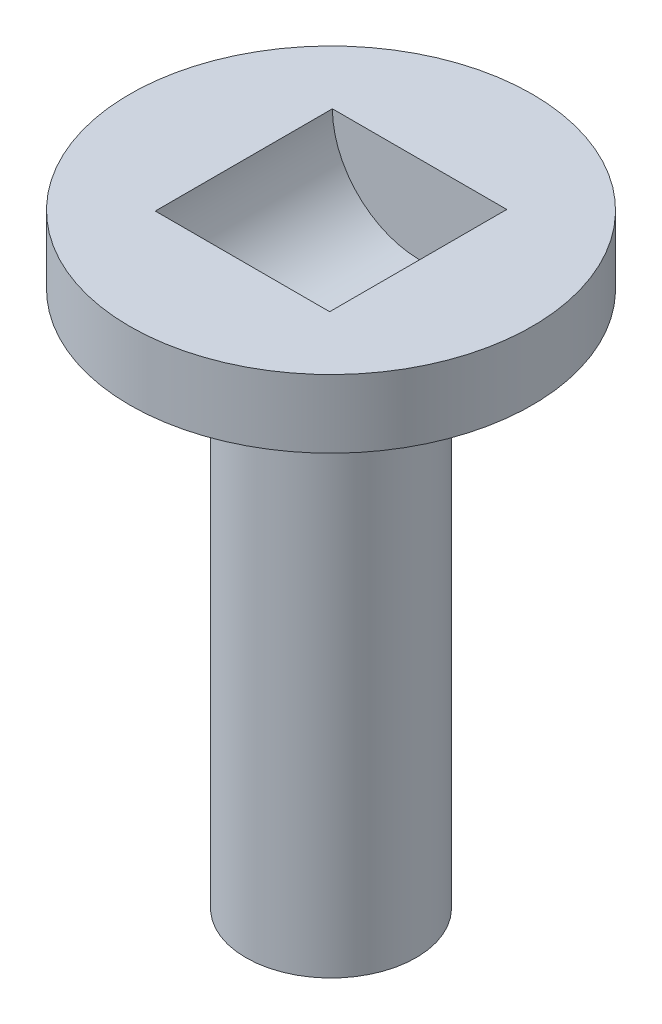
ISO-10303-21;
HEADER;
FILE_DESCRIPTION(('STEP AP214'),'2;1');
FILE_NAME('part.step','',(''),(''),'','','');
FILE_SCHEMA(('AUTOMOTIVE_DESIGN { 1 0 10303 214 1 1 1 1 }'));
ENDSEC;
DATA;
#1=APPLICATION_CONTEXT('core data for automotive mechanical design processes');
#2=APPLICATION_PROTOCOL_DEFINITION('international standard','automotive_design',2000,#1);
#3=PRODUCT_CONTEXT('',#1,'mechanical');
#4=PRODUCT('Part','Part','',(#3));
#5=PRODUCT_RELATED_PRODUCT_CATEGORY('part','',(#4));
#6=PRODUCT_DEFINITION_FORMATION('','',#4);
#7=PRODUCT_DEFINITION_CONTEXT('part definition',#1,'design');
#8=PRODUCT_DEFINITION('design','',#6,#7);
#9=PRODUCT_DEFINITION_SHAPE('','',#8);
#10=(LENGTH_UNIT() NAMED_UNIT(*) SI_UNIT(.MILLI.,.METRE.));
#11=(NAMED_UNIT(*) PLANE_ANGLE_UNIT() SI_UNIT($,.RADIAN.));
#12=(NAMED_UNIT(*) SI_UNIT($,.STERADIAN.) SOLID_ANGLE_UNIT());
#13=UNCERTAINTY_MEASURE_WITH_UNIT(LENGTH_MEASURE(1.E-05),#10,'distance_accuracy_value','');
#14=(GEOMETRIC_REPRESENTATION_CONTEXT(3) GLOBAL_UNCERTAINTY_ASSIGNED_CONTEXT((#13)) GLOBAL_UNIT_ASSIGNED_CONTEXT((#10,
#11,#12)) REPRESENTATION_CONTEXT('',''));
#15=CARTESIAN_POINT('',(0.,0.,0.));
#16=DIRECTION('',(0.,0.,1.));
#17=DIRECTION('',(1.,0.,0.));
#18=AXIS2_PLACEMENT_3D('',#15,#16,#17);
#19=CARTESIAN_POINT('',(0.,20.,0.));
#20=DIRECTION('',(0.,-1.,0.));
#21=DIRECTION('',(0.,0.,-1.));
#22=AXIS2_PLACEMENT_3D('',#19,#20,#21);
#23=CYLINDRICAL_SURFACE('',#22,3.175);
#24=CARTESIAN_POINT('',(0.,0.,0.));
#25=DIRECTION('',(0.,1.,0.));
#26=DIRECTION('',(0.,0.,1.));
#27=AXIS2_PLACEMENT_3D('',#24,#25,#26);
#28=CIRCLE('',#27,3.175);
#29=CARTESIAN_POINT('',(0.,0.,3.175));
#30=VERTEX_POINT('',#29);
#31=EDGE_CURVE('E87',#30,#30,#28,.T.);
#32=ORIENTED_EDGE('',*,*,#31,.T.);
#33=EDGE_LOOP('',(#32));
#34=FACE_BOUND('',#33,.T.);
#35=CARTESIAN_POINT('',(0.,19.19,0.));
#36=DIRECTION('',(0.,1.,0.));
#37=DIRECTION('',(0.,0.,1.));
#38=AXIS2_PLACEMENT_3D('',#35,#36,#37);
#39=CIRCLE('',#38,3.175);
#40=CARTESIAN_POINT('',(0.,19.19,3.175));
#41=VERTEX_POINT('',#40);
#42=EDGE_CURVE('E71',#41,#41,#39,.T.);
#43=ORIENTED_EDGE('',*,*,#42,.F.);
#44=EDGE_LOOP('',(#43));
#45=FACE_BOUND('',#44,.T.);
#46=ADVANCED_FACE('F39',(#34,#45),#23,.T.);
#47=CARTESIAN_POINT('',(0.,0.,0.));
#48=DIRECTION('',(0.,1.,0.));
#49=DIRECTION('',(0.,0.,1.));
#50=AXIS2_PLACEMENT_3D('',#47,#48,#49);
#51=PLANE('',#50);
#52=CARTESIAN_POINT('',(0.,0.,0.));
#53=DIRECTION('',(0.,-1.,0.));
#54=DIRECTION('',(0.,0.,-1.));
#55=AXIS2_PLACEMENT_3D('',#52,#53,#54);
#56=CIRCLE('',#55,0.9);
#57=CARTESIAN_POINT('',(0.,0.,-0.9));
#58=VERTEX_POINT('',#57);
#59=EDGE_CURVE('E92',#58,#58,#56,.T.);
#60=ORIENTED_EDGE('',*,*,#59,.F.);
#61=EDGE_LOOP('',(#60));
#62=FACE_BOUND('',#61,.T.);
#63=ORIENTED_EDGE('',*,*,#31,.F.);
#64=EDGE_LOOP('',(#63));
#65=FACE_BOUND('',#64,.T.);
#66=ADVANCED_FACE('F128',(#62,#65),#51,.F.);
#67=CARTESIAN_POINT('',(0.,10.,0.));
#68=DIRECTION('',(0.,-1.,0.));
#69=DIRECTION('',(0.,0.,-1.));
#70=AXIS2_PLACEMENT_3D('',#67,#68,#69);
#71=CYLINDRICAL_SURFACE('',#70,0.9);
#72=CARTESIAN_POINT('',(0.,10.,0.));
#73=DIRECTION('',(0.,-1.,0.));
#74=DIRECTION('',(0.,0.,-1.));
#75=AXIS2_PLACEMENT_3D('',#72,#73,#74);
#76=CIRCLE('',#75,0.9);
#77=CARTESIAN_POINT('',(0.,10.,-0.9));
#78=VERTEX_POINT('',#77);
#79=EDGE_CURVE('E91',#78,#78,#76,.T.);
#80=ORIENTED_EDGE('',*,*,#79,.F.);
#81=EDGE_LOOP('',(#80));
#82=FACE_BOUND('',#81,.T.);
#83=ORIENTED_EDGE('',*,*,#59,.T.);
#84=EDGE_LOOP('',(#83));
#85=FACE_BOUND('',#84,.T.);
#86=ADVANCED_FACE('F133',(#82,#85),#71,.F.);
#87=CARTESIAN_POINT('',(0.,10.,0.));
#88=DIRECTION('',(0.,-1.,0.));
#89=DIRECTION('',(0.,0.,-1.));
#90=AXIS2_PLACEMENT_3D('',#87,#88,#89);
#91=PLANE('',#90);
#92=ORIENTED_EDGE('',*,*,#79,.T.);
#93=EDGE_LOOP('',(#92));
#94=FACE_BOUND('',#93,.T.);
#95=ADVANCED_FACE('F142',(#94),#91,.T.);
#96=CARTESIAN_POINT('',(0.,19.19,0.));
#97=DIRECTION('',(0.,1.,0.));
#98=DIRECTION('',(0.,0.,1.));
#99=AXIS2_PLACEMENT_3D('',#96,#97,#98);
#100=PLANE('',#99);
#101=CARTESIAN_POINT('',(0.,19.19,0.));
#102=DIRECTION('',(0.,1.,0.));
#103=DIRECTION('',(0.,0.,1.));
#104=AXIS2_PLACEMENT_3D('',#101,#102,#103);
#105=CIRCLE('',#104,4.85);
#106=CARTESIAN_POINT('',(0.,19.19,4.85));
#107=VERTEX_POINT('',#106);
#108=EDGE_CURVE('E111',#107,#107,#105,.T.);
#109=ORIENTED_EDGE('',*,*,#108,.F.);
#110=EDGE_LOOP('',(#109));
#111=FACE_BOUND('',#110,.T.);
#112=ORIENTED_EDGE('',*,*,#42,.T.);
#113=EDGE_LOOP('',(#112));
#114=FACE_BOUND('',#113,.T.);
#115=ADVANCED_FACE('F139',(#111,#114),#100,.F.);
#116=CARTESIAN_POINT('',(0.,19.19,0.));
#117=DIRECTION('',(0.,1.,0.));
#118=DIRECTION('',(0.,0.,1.));
#119=AXIS2_PLACEMENT_3D('',#116,#117,#118);
#120=CYLINDRICAL_SURFACE('',#119,4.85);
#121=ORIENTED_EDGE('',*,*,#108,.T.);
#122=EDGE_LOOP('',(#121));
#123=FACE_BOUND('',#122,.T.);
#124=CARTESIAN_POINT('',(0.,20.,0.));
#125=DIRECTION('',(0.,1.,0.));
#126=DIRECTION('',(0.,0.,1.));
#127=AXIS2_PLACEMENT_3D('',#124,#125,#126);
#128=CIRCLE('',#127,4.85);
#129=CARTESIAN_POINT('',(0.,20.,4.85));
#130=VERTEX_POINT('',#129);
#131=EDGE_CURVE('E104',#130,#130,#128,.T.);
#132=ORIENTED_EDGE('',*,*,#131,.F.);
#133=EDGE_LOOP('',(#132));
#134=FACE_BOUND('',#133,.T.);
#135=ADVANCED_FACE('F141',(#123,#134),#120,.T.);
#136=CARTESIAN_POINT('',(0.,22.54,0.));
#137=DIRECTION('',(0.,1.,0.));
#138=DIRECTION('',(0.,0.,1.));
#139=AXIS2_PLACEMENT_3D('',#136,#137,#138);
#140=PLANE('',#139);
#141=DIRECTION('',(1.,0.,0.));
#142=VECTOR('',#141,1.);
#143=CARTESIAN_POINT('',(0.,22.54,3.3));
#144=LINE('',#143,#142);
#145=CARTESIAN_POINT('',(-3.25,22.54,3.3));
#146=VERTEX_POINT('',#145);
#147=CARTESIAN_POINT('',(3.25,22.54,3.3));
#148=VERTEX_POINT('',#147);
#149=EDGE_CURVE('E11',#146,#148,#144,.T.);
#150=ORIENTED_EDGE('',*,*,#149,.F.);
#151=DIRECTION('',(0.,0.,-1.));
#152=VECTOR('',#151,1.);
#153=CARTESIAN_POINT('',(-3.25,22.54,3.3));
#154=LINE('',#153,#152);
#155=CARTESIAN_POINT('',(-3.25,22.54,-3.302));
#156=VERTEX_POINT('',#155);
#157=EDGE_CURVE('E60',#146,#156,#154,.T.);
#158=ORIENTED_EDGE('',*,*,#157,.T.);
#159=DIRECTION('',(1.,0.,0.));
#160=VECTOR('',#159,1.);
#161=CARTESIAN_POINT('',(0.,22.54,-3.302));
#162=LINE('',#161,#160);
#163=CARTESIAN_POINT('',(3.25,22.54,-3.302));
#164=VERTEX_POINT('',#163);
#165=EDGE_CURVE('E66',#156,#164,#162,.T.);
#166=ORIENTED_EDGE('',*,*,#165,.T.);
#167=DIRECTION('',(0.,0.,-1.));
#168=VECTOR('',#167,1.);
#169=CARTESIAN_POINT('',(3.25,22.54,3.3));
#170=LINE('',#169,#168);
#171=EDGE_CURVE('E47',#164,#148,#170,.F.);
#172=ORIENTED_EDGE('',*,*,#171,.T.);
#173=EDGE_LOOP('',(#150,#158,#166,#172));
#174=FACE_BOUND('',#173,.T.);
#175=CARTESIAN_POINT('',(0.,22.54,0.));
#176=DIRECTION('',(0.,1.,0.));
#177=DIRECTION('',(0.,0.,1.));
#178=AXIS2_PLACEMENT_3D('',#175,#176,#177);
#179=CIRCLE('',#178,7.5);
#180=CARTESIAN_POINT('',(0.,22.54,7.5));
#181=VERTEX_POINT('',#180);
#182=EDGE_CURVE('E96',#181,#181,#179,.T.);
#183=ORIENTED_EDGE('',*,*,#182,.T.);
#184=EDGE_LOOP('',(#183));
#185=FACE_BOUND('',#184,.T.);
#186=ADVANCED_FACE('F78',(#174,#185),#140,.T.);
#187=CARTESIAN_POINT('',(0.,22.54,0.));
#188=DIRECTION('',(0.,-1.,0.));
#189=DIRECTION('',(0.,0.,-1.));
#190=AXIS2_PLACEMENT_3D('',#187,#188,#189);
#191=CYLINDRICAL_SURFACE('',#190,7.5);
#192=ORIENTED_EDGE('',*,*,#182,.F.);
#193=EDGE_LOOP('',(#192));
#194=FACE_BOUND('',#193,.T.);
#195=CARTESIAN_POINT('',(0.,20.,0.));
#196=DIRECTION('',(0.,1.,0.));
#197=DIRECTION('',(0.,0.,1.));
#198=AXIS2_PLACEMENT_3D('',#195,#196,#197);
#199=CIRCLE('',#198,7.5);
#200=CARTESIAN_POINT('',(0.,20.,7.5));
#201=VERTEX_POINT('',#200);
#202=EDGE_CURVE('E100',#201,#201,#199,.T.);
#203=ORIENTED_EDGE('',*,*,#202,.T.);
#204=EDGE_LOOP('',(#203));
#205=FACE_BOUND('',#204,.T.);
#206=ADVANCED_FACE('F157',(#194,#205),#191,.T.);
#207=CARTESIAN_POINT('',(0.,20.,0.));
#208=DIRECTION('',(0.,1.,0.));
#209=DIRECTION('',(0.,0.,1.));
#210=AXIS2_PLACEMENT_3D('',#207,#208,#209);
#211=PLANE('',#210);
#212=ORIENTED_EDGE('',*,*,#131,.T.);
#213=EDGE_LOOP('',(#212));
#214=FACE_BOUND('',#213,.T.);
#215=ORIENTED_EDGE('',*,*,#202,.F.);
#216=EDGE_LOOP('',(#215));
#217=FACE_BOUND('',#216,.T.);
#218=ADVANCED_FACE('F125',(#214,#217),#211,.F.);
#219=CARTESIAN_POINT('',(0.,22.54,3.3));
#220=DIRECTION('',(0.,0.,-1.));
#221=DIRECTION('',(-1.,0.,0.));
#222=AXIS2_PLACEMENT_3D('',#219,#220,#221);
#223=CYLINDRICAL_SURFACE('',#222,3.25);
#224=CARTESIAN_POINT('',(0.,22.54,-3.302));
#225=DIRECTION('',(0.,0.,1.));
#226=DIRECTION('',(1.,0.,0.));
#227=AXIS2_PLACEMENT_3D('',#224,#225,#226);
#228=CIRCLE('',#227,3.25);
#229=EDGE_CURVE('E53',#156,#164,#228,.T.);
#230=ORIENTED_EDGE('',*,*,#229,.F.);
#231=ORIENTED_EDGE('',*,*,#157,.F.);
#232=CARTESIAN_POINT('',(0.,22.54,3.3));
#233=DIRECTION('',(0.,0.,1.));
#234=DIRECTION('',(1.,0.,0.));
#235=AXIS2_PLACEMENT_3D('',#232,#233,#234);
#236=CIRCLE('',#235,3.25);
#237=EDGE_CURVE('E75',#146,#148,#236,.T.);
#238=ORIENTED_EDGE('',*,*,#237,.T.);
#239=ORIENTED_EDGE('',*,*,#171,.F.);
#240=EDGE_LOOP('',(#230,#231,#238,#239));
#241=FACE_BOUND('',#240,.T.);
#242=ADVANCED_FACE('F73',(#241),#223,.F.);
#243=CARTESIAN_POINT('',(0.,22.54,3.3));
#244=DIRECTION('',(0.,0.,1.));
#245=DIRECTION('',(1.,0.,0.));
#246=AXIS2_PLACEMENT_3D('',#243,#244,#245);
#247=PLANE('',#246);
#248=ORIENTED_EDGE('',*,*,#149,.T.);
#249=ORIENTED_EDGE('',*,*,#237,.F.);
#250=EDGE_LOOP('',(#248,#249));
#251=FACE_BOUND('',#250,.T.);
#252=ADVANCED_FACE('F117',(#251),#247,.F.);
#253=CARTESIAN_POINT('',(0.,22.54,-3.302));
#254=DIRECTION('',(0.,0.,1.));
#255=DIRECTION('',(1.,0.,0.));
#256=AXIS2_PLACEMENT_3D('',#253,#254,#255);
#257=PLANE('',#256);
#258=ORIENTED_EDGE('',*,*,#229,.T.);
#259=ORIENTED_EDGE('',*,*,#165,.F.);
#260=EDGE_LOOP('',(#258,#259));
#261=FACE_BOUND('',#260,.T.);
#262=ADVANCED_FACE('F67',(#261),#257,.T.);
#263=CLOSED_SHELL('',(#46,#66,#86,#95,#115,#135,#186,#206,#218,#242,#252,#262));
#264=MANIFOLD_SOLID_BREP('B2',#263);
#265=ADVANCED_BREP_SHAPE_REPRESENTATION('',(#18,#264),#14);
#266=SHAPE_DEFINITION_REPRESENTATION(#9,#265);
ENDSEC;
END-ISO-10303-21;
